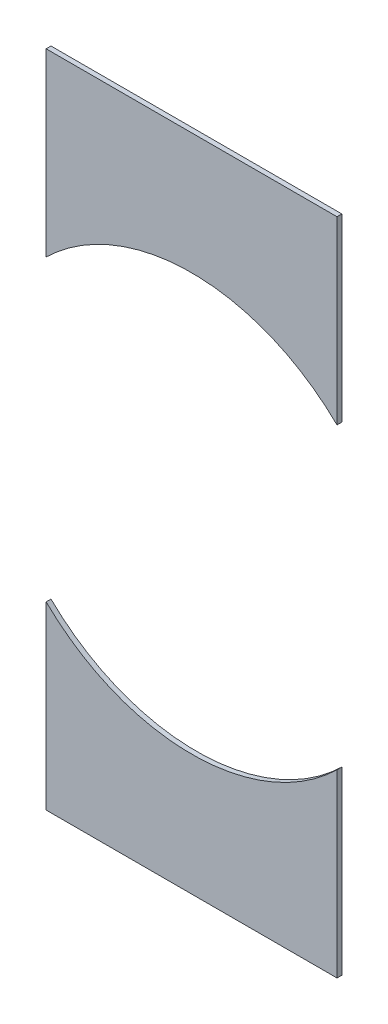
ISO-10303-21;
HEADER;
FILE_DESCRIPTION(('STEP AP214'),'2;1');
FILE_NAME('part.step','',(''),(''),'','','');
FILE_SCHEMA(('AUTOMOTIVE_DESIGN { 1 0 10303 214 1 1 1 1 }'));
ENDSEC;
DATA;
#1=APPLICATION_CONTEXT('core data for automotive mechanical design processes');
#2=APPLICATION_PROTOCOL_DEFINITION('international standard','automotive_design',2000,#1);
#3=PRODUCT_CONTEXT('',#1,'mechanical');
#4=PRODUCT('Part','Part','',(#3));
#5=PRODUCT_RELATED_PRODUCT_CATEGORY('part','',(#4));
#6=PRODUCT_DEFINITION_FORMATION('','',#4);
#7=PRODUCT_DEFINITION_CONTEXT('part definition',#1,'design');
#8=PRODUCT_DEFINITION('design','',#6,#7);
#9=PRODUCT_DEFINITION_SHAPE('','',#8);
#10=(LENGTH_UNIT() NAMED_UNIT(*) SI_UNIT(.MILLI.,.METRE.));
#11=(NAMED_UNIT(*) PLANE_ANGLE_UNIT() SI_UNIT($,.RADIAN.));
#12=(NAMED_UNIT(*) SI_UNIT($,.STERADIAN.) SOLID_ANGLE_UNIT());
#13=UNCERTAINTY_MEASURE_WITH_UNIT(LENGTH_MEASURE(1.E-05),#10,'distance_accuracy_value','');
#14=(GEOMETRIC_REPRESENTATION_CONTEXT(3) GLOBAL_UNCERTAINTY_ASSIGNED_CONTEXT((#13)) GLOBAL_UNIT_ASSIGNED_CONTEXT((#10,
#11,#12)) REPRESENTATION_CONTEXT('',''));
#15=CARTESIAN_POINT('',(0.,0.,0.));
#16=DIRECTION('',(0.,0.,1.));
#17=DIRECTION('',(1.,0.,0.));
#18=AXIS2_PLACEMENT_3D('',#15,#16,#17);
#19=CARTESIAN_POINT('',(0.,0.,1.));
#20=DIRECTION('',(0.,0.,-1.));
#21=DIRECTION('',(-1.,0.,0.));
#22=AXIS2_PLACEMENT_3D('',#19,#20,#21);
#23=CYLINDRICAL_SURFACE('',#22,43.);
#24=CARTESIAN_POINT('',(0.,0.,0.));
#25=DIRECTION('',(0.,0.,1.));
#26=DIRECTION('',(1.,0.,0.));
#27=AXIS2_PLACEMENT_3D('',#24,#25,#26);
#28=CIRCLE('',#27,43.);
#29=CARTESIAN_POINT('',(-30.,-30.8058436014987,0.));
#30=VERTEX_POINT('',#29);
#31=CARTESIAN_POINT('',(30.,-30.8058436014987,0.));
#32=VERTEX_POINT('',#31);
#33=EDGE_CURVE('E114',#30,#32,#28,.T.);
#34=ORIENTED_EDGE('',*,*,#33,.F.);
#35=DIRECTION('',(0.,0.,-1.));
#36=VECTOR('',#35,1.);
#37=CARTESIAN_POINT('',(-30.,-30.8058436014987,1.));
#38=LINE('',#37,#36);
#39=CARTESIAN_POINT('',(-30.,-30.8058436014987,1.));
#40=VERTEX_POINT('',#39);
#41=EDGE_CURVE('E12',#40,#30,#38,.T.);
#42=ORIENTED_EDGE('',*,*,#41,.F.);
#43=CARTESIAN_POINT('',(0.,0.,1.));
#44=DIRECTION('',(0.,0.,1.));
#45=DIRECTION('',(1.,0.,0.));
#46=AXIS2_PLACEMENT_3D('',#43,#44,#45);
#47=CIRCLE('',#46,43.);
#48=CARTESIAN_POINT('',(30.,-30.8058436014987,1.));
#49=VERTEX_POINT('',#48);
#50=EDGE_CURVE('E108',#40,#49,#47,.T.);
#51=ORIENTED_EDGE('',*,*,#50,.T.);
#52=DIRECTION('',(0.,0.,-1.));
#53=VECTOR('',#52,1.);
#54=CARTESIAN_POINT('',(30.,-30.8058436014987,1.));
#55=LINE('',#54,#53);
#56=EDGE_CURVE('E89',#49,#32,#55,.T.);
#57=ORIENTED_EDGE('',*,*,#56,.T.);
#58=EDGE_LOOP('',(#34,#42,#51,#57));
#59=FACE_BOUND('',#58,.T.);
#60=ADVANCED_FACE('F51',(#59),#23,.F.);
#61=CARTESIAN_POINT('',(-30.,0.,1.));
#62=DIRECTION('',(-1.,0.,0.));
#63=DIRECTION('',(0.,0.,1.));
#64=AXIS2_PLACEMENT_3D('',#61,#62,#63);
#65=PLANE('',#64);
#66=DIRECTION('',(0.,1.,0.));
#67=VECTOR('',#66,1.);
#68=CARTESIAN_POINT('',(-30.,0.,0.));
#69=LINE('',#68,#67);
#70=CARTESIAN_POINT('',(-30.,-68.,0.));
#71=VERTEX_POINT('',#70);
#72=EDGE_CURVE('E102',#71,#30,#69,.T.);
#73=ORIENTED_EDGE('',*,*,#72,.F.);
#74=DIRECTION('',(0.,0.,-1.));
#75=VECTOR('',#74,1.);
#76=CARTESIAN_POINT('',(-30.,-68.,1.));
#77=LINE('',#76,#75);
#78=CARTESIAN_POINT('',(-30.,-68.,1.));
#79=VERTEX_POINT('',#78);
#80=EDGE_CURVE('E59',#79,#71,#77,.T.);
#81=ORIENTED_EDGE('',*,*,#80,.F.);
#82=DIRECTION('',(0.,1.,0.));
#83=VECTOR('',#82,1.);
#84=CARTESIAN_POINT('',(-30.,0.,1.));
#85=LINE('',#84,#83);
#86=EDGE_CURVE('E100',#79,#40,#85,.T.);
#87=ORIENTED_EDGE('',*,*,#86,.T.);
#88=ORIENTED_EDGE('',*,*,#41,.T.);
#89=EDGE_LOOP('',(#73,#81,#87,#88));
#90=FACE_BOUND('',#89,.T.);
#91=ADVANCED_FACE('F98',(#90),#65,.T.);
#92=CARTESIAN_POINT('',(0.,-68.,1.));
#93=DIRECTION('',(0.,1.,0.));
#94=DIRECTION('',(0.,0.,1.));
#95=AXIS2_PLACEMENT_3D('',#92,#93,#94);
#96=PLANE('',#95);
#97=DIRECTION('',(1.,0.,0.));
#98=VECTOR('',#97,1.);
#99=CARTESIAN_POINT('',(0.,-68.,0.));
#100=LINE('',#99,#98);
#101=CARTESIAN_POINT('',(30.,-68.,0.));
#102=VERTEX_POINT('',#101);
#103=EDGE_CURVE('E82',#71,#102,#100,.T.);
#104=ORIENTED_EDGE('',*,*,#103,.T.);
#105=DIRECTION('',(0.,0.,-1.));
#106=VECTOR('',#105,1.);
#107=CARTESIAN_POINT('',(30.,-68.,1.));
#108=LINE('',#107,#106);
#109=CARTESIAN_POINT('',(30.,-68.,1.));
#110=VERTEX_POINT('',#109);
#111=EDGE_CURVE('E103',#110,#102,#108,.T.);
#112=ORIENTED_EDGE('',*,*,#111,.F.);
#113=DIRECTION('',(1.,0.,0.));
#114=VECTOR('',#113,1.);
#115=CARTESIAN_POINT('',(0.,-68.,1.));
#116=LINE('',#115,#114);
#117=EDGE_CURVE('E104',#79,#110,#116,.T.);
#118=ORIENTED_EDGE('',*,*,#117,.F.);
#119=ORIENTED_EDGE('',*,*,#80,.T.);
#120=EDGE_LOOP('',(#104,#112,#118,#119));
#121=FACE_BOUND('',#120,.T.);
#122=ADVANCED_FACE('F105',(#121),#96,.F.);
#123=CARTESIAN_POINT('',(30.,0.,1.));
#124=DIRECTION('',(-1.,0.,0.));
#125=DIRECTION('',(0.,0.,1.));
#126=AXIS2_PLACEMENT_3D('',#123,#124,#125);
#127=PLANE('',#126);
#128=DIRECTION('',(0.,1.,0.));
#129=VECTOR('',#128,1.);
#130=CARTESIAN_POINT('',(30.,0.,0.));
#131=LINE('',#130,#129);
#132=EDGE_CURVE('E110',#102,#32,#131,.T.);
#133=ORIENTED_EDGE('',*,*,#132,.T.);
#134=ORIENTED_EDGE('',*,*,#56,.F.);
#135=DIRECTION('',(0.,1.,0.));
#136=VECTOR('',#135,1.);
#137=CARTESIAN_POINT('',(30.,0.,1.));
#138=LINE('',#137,#136);
#139=EDGE_CURVE('E67',#110,#49,#138,.T.);
#140=ORIENTED_EDGE('',*,*,#139,.F.);
#141=ORIENTED_EDGE('',*,*,#111,.T.);
#142=EDGE_LOOP('',(#133,#134,#140,#141));
#143=FACE_BOUND('',#142,.T.);
#144=ADVANCED_FACE('F123',(#143),#127,.F.);
#145=CARTESIAN_POINT('',(0.,0.,1.));
#146=DIRECTION('',(0.,0.,1.));
#147=DIRECTION('',(1.,0.,0.));
#148=AXIS2_PLACEMENT_3D('',#145,#146,#147);
#149=PLANE('',#148);
#150=ORIENTED_EDGE('',*,*,#50,.F.);
#151=ORIENTED_EDGE('',*,*,#86,.F.);
#152=ORIENTED_EDGE('',*,*,#117,.T.);
#153=ORIENTED_EDGE('',*,*,#139,.T.);
#154=EDGE_LOOP('',(#150,#151,#152,#153));
#155=FACE_BOUND('',#154,.T.);
#156=ADVANCED_FACE('F107',(#155),#149,.T.);
#157=CARTESIAN_POINT('',(0.,0.,0.));
#158=DIRECTION('',(0.,0.,1.));
#159=DIRECTION('',(1.,0.,0.));
#160=AXIS2_PLACEMENT_3D('',#157,#158,#159);
#161=PLANE('',#160);
#162=ORIENTED_EDGE('',*,*,#33,.T.);
#163=ORIENTED_EDGE('',*,*,#132,.F.);
#164=ORIENTED_EDGE('',*,*,#103,.F.);
#165=ORIENTED_EDGE('',*,*,#72,.T.);
#166=EDGE_LOOP('',(#162,#163,#164,#165));
#167=FACE_BOUND('',#166,.T.);
#168=ADVANCED_FACE('F125',(#167),#161,.F.);
#169=CLOSED_SHELL('',(#60,#91,#122,#144,#156,#168));
#170=MANIFOLD_SOLID_BREP('B2',#169);
#171=CARTESIAN_POINT('',(0.,0.,1.));
#172=DIRECTION('',(0.,0.,-1.));
#173=DIRECTION('',(-1.,0.,0.));
#174=AXIS2_PLACEMENT_3D('',#171,#172,#173);
#175=CYLINDRICAL_SURFACE('',#174,43.);
#176=CARTESIAN_POINT('',(0.,0.,0.));
#177=DIRECTION('',(0.,0.,1.));
#178=DIRECTION('',(1.,0.,0.));
#179=AXIS2_PLACEMENT_3D('',#176,#177,#178);
#180=CIRCLE('',#179,43.);
#181=CARTESIAN_POINT('',(30.,30.8058436014987,0.));
#182=VERTEX_POINT('',#181);
#183=CARTESIAN_POINT('',(-30.,30.8058436014987,0.));
#184=VERTEX_POINT('',#183);
#185=EDGE_CURVE('E238',#182,#184,#180,.T.);
#186=ORIENTED_EDGE('',*,*,#185,.F.);
#187=DIRECTION('',(0.,0.,-1.));
#188=VECTOR('',#187,1.);
#189=CARTESIAN_POINT('',(30.,30.8058436014987,1.));
#190=LINE('',#189,#188);
#191=CARTESIAN_POINT('',(30.,30.8058436014987,1.));
#192=VERTEX_POINT('',#191);
#193=EDGE_CURVE('E49',#192,#182,#190,.T.);
#194=ORIENTED_EDGE('',*,*,#193,.F.);
#195=CARTESIAN_POINT('',(0.,0.,1.));
#196=DIRECTION('',(0.,0.,1.));
#197=DIRECTION('',(1.,0.,0.));
#198=AXIS2_PLACEMENT_3D('',#195,#196,#197);
#199=CIRCLE('',#198,43.);
#200=CARTESIAN_POINT('',(-30.,30.8058436014987,1.));
#201=VERTEX_POINT('',#200);
#202=EDGE_CURVE('E231',#192,#201,#199,.T.);
#203=ORIENTED_EDGE('',*,*,#202,.T.);
#204=DIRECTION('',(0.,0.,-1.));
#205=VECTOR('',#204,1.);
#206=CARTESIAN_POINT('',(-30.,30.8058436014987,1.));
#207=LINE('',#206,#205);
#208=EDGE_CURVE('E213',#201,#184,#207,.T.);
#209=ORIENTED_EDGE('',*,*,#208,.T.);
#210=EDGE_LOOP('',(#186,#194,#203,#209));
#211=FACE_BOUND('',#210,.T.);
#212=ADVANCED_FACE('F175',(#211),#175,.F.);
#213=CARTESIAN_POINT('',(30.,0.,1.));
#214=DIRECTION('',(1.,0.,0.));
#215=DIRECTION('',(0.,0.,-1.));
#216=AXIS2_PLACEMENT_3D('',#213,#214,#215);
#217=PLANE('',#216);
#218=DIRECTION('',(0.,-1.,0.));
#219=VECTOR('',#218,1.);
#220=CARTESIAN_POINT('',(30.,0.,0.));
#221=LINE('',#220,#219);
#222=CARTESIAN_POINT('',(30.,68.,0.));
#223=VERTEX_POINT('',#222);
#224=EDGE_CURVE('E224',#223,#182,#221,.T.);
#225=ORIENTED_EDGE('',*,*,#224,.F.);
#226=DIRECTION('',(0.,0.,-1.));
#227=VECTOR('',#226,1.);
#228=CARTESIAN_POINT('',(30.,68.,1.));
#229=LINE('',#228,#227);
#230=CARTESIAN_POINT('',(30.,68.,1.));
#231=VERTEX_POINT('',#230);
#232=EDGE_CURVE('E183',#231,#223,#229,.T.);
#233=ORIENTED_EDGE('',*,*,#232,.F.);
#234=DIRECTION('',(0.,-1.,0.));
#235=VECTOR('',#234,1.);
#236=CARTESIAN_POINT('',(30.,0.,1.));
#237=LINE('',#236,#235);
#238=EDGE_CURVE('E222',#231,#192,#237,.T.);
#239=ORIENTED_EDGE('',*,*,#238,.T.);
#240=ORIENTED_EDGE('',*,*,#193,.T.);
#241=EDGE_LOOP('',(#225,#233,#239,#240));
#242=FACE_BOUND('',#241,.T.);
#243=ADVANCED_FACE('F221',(#242),#217,.T.);
#244=CARTESIAN_POINT('',(0.,68.,1.));
#245=DIRECTION('',(0.,1.,0.));
#246=DIRECTION('',(0.,0.,1.));
#247=AXIS2_PLACEMENT_3D('',#244,#245,#246);
#248=PLANE('',#247);
#249=DIRECTION('',(1.,0.,0.));
#250=VECTOR('',#249,1.);
#251=CARTESIAN_POINT('',(0.,68.,0.));
#252=LINE('',#251,#250);
#253=CARTESIAN_POINT('',(-30.,68.,0.));
#254=VERTEX_POINT('',#253);
#255=EDGE_CURVE('E242',#254,#223,#252,.T.);
#256=ORIENTED_EDGE('',*,*,#255,.F.);
#257=DIRECTION('',(0.,0.,-1.));
#258=VECTOR('',#257,1.);
#259=CARTESIAN_POINT('',(-30.,68.,1.));
#260=LINE('',#259,#258);
#261=CARTESIAN_POINT('',(-30.,68.,1.));
#262=VERTEX_POINT('',#261);
#263=EDGE_CURVE('E206',#262,#254,#260,.T.);
#264=ORIENTED_EDGE('',*,*,#263,.F.);
#265=DIRECTION('',(1.,0.,0.));
#266=VECTOR('',#265,1.);
#267=CARTESIAN_POINT('',(0.,68.,1.));
#268=LINE('',#267,#266);
#269=EDGE_CURVE('E230',#262,#231,#268,.T.);
#270=ORIENTED_EDGE('',*,*,#269,.T.);
#271=ORIENTED_EDGE('',*,*,#232,.T.);
#272=EDGE_LOOP('',(#256,#264,#270,#271));
#273=FACE_BOUND('',#272,.T.);
#274=ADVANCED_FACE('F233',(#273),#248,.T.);
#275=CARTESIAN_POINT('',(-30.,0.,1.));
#276=DIRECTION('',(1.,0.,0.));
#277=DIRECTION('',(0.,0.,-1.));
#278=AXIS2_PLACEMENT_3D('',#275,#276,#277);
#279=PLANE('',#278);
#280=DIRECTION('',(0.,-1.,0.));
#281=VECTOR('',#280,1.);
#282=CARTESIAN_POINT('',(-30.,0.,0.));
#283=LINE('',#282,#281);
#284=EDGE_CURVE('E244',#254,#184,#283,.T.);
#285=ORIENTED_EDGE('',*,*,#284,.T.);
#286=ORIENTED_EDGE('',*,*,#208,.F.);
#287=DIRECTION('',(0.,-1.,0.));
#288=VECTOR('',#287,1.);
#289=CARTESIAN_POINT('',(-30.,0.,1.));
#290=LINE('',#289,#288);
#291=EDGE_CURVE('E191',#262,#201,#290,.T.);
#292=ORIENTED_EDGE('',*,*,#291,.F.);
#293=ORIENTED_EDGE('',*,*,#263,.T.);
#294=EDGE_LOOP('',(#285,#286,#292,#293));
#295=FACE_BOUND('',#294,.T.);
#296=ADVANCED_FACE('F254',(#295),#279,.F.);
#297=CARTESIAN_POINT('',(0.,0.,1.));
#298=DIRECTION('',(0.,0.,1.));
#299=DIRECTION('',(1.,0.,0.));
#300=AXIS2_PLACEMENT_3D('',#297,#298,#299);
#301=PLANE('',#300);
#302=ORIENTED_EDGE('',*,*,#202,.F.);
#303=ORIENTED_EDGE('',*,*,#238,.F.);
#304=ORIENTED_EDGE('',*,*,#269,.F.);
#305=ORIENTED_EDGE('',*,*,#291,.T.);
#306=EDGE_LOOP('',(#302,#303,#304,#305));
#307=FACE_BOUND('',#306,.T.);
#308=ADVANCED_FACE('F229',(#307),#301,.T.);
#309=CARTESIAN_POINT('',(0.,0.,0.));
#310=DIRECTION('',(0.,0.,1.));
#311=DIRECTION('',(1.,0.,0.));
#312=AXIS2_PLACEMENT_3D('',#309,#310,#311);
#313=PLANE('',#312);
#314=ORIENTED_EDGE('',*,*,#185,.T.);
#315=ORIENTED_EDGE('',*,*,#284,.F.);
#316=ORIENTED_EDGE('',*,*,#255,.T.);
#317=ORIENTED_EDGE('',*,*,#224,.T.);
#318=EDGE_LOOP('',(#314,#315,#316,#317));
#319=FACE_BOUND('',#318,.T.);
#320=ADVANCED_FACE('F259',(#319),#313,.F.);
#321=CLOSED_SHELL('',(#212,#243,#274,#296,#308,#320));
#322=MANIFOLD_SOLID_BREP('B6',#321);
#323=ADVANCED_BREP_SHAPE_REPRESENTATION('',(#18,#170,#322),#14);
#324=SHAPE_DEFINITION_REPRESENTATION(#9,#323);
ENDSEC;
END-ISO-10303-21;
